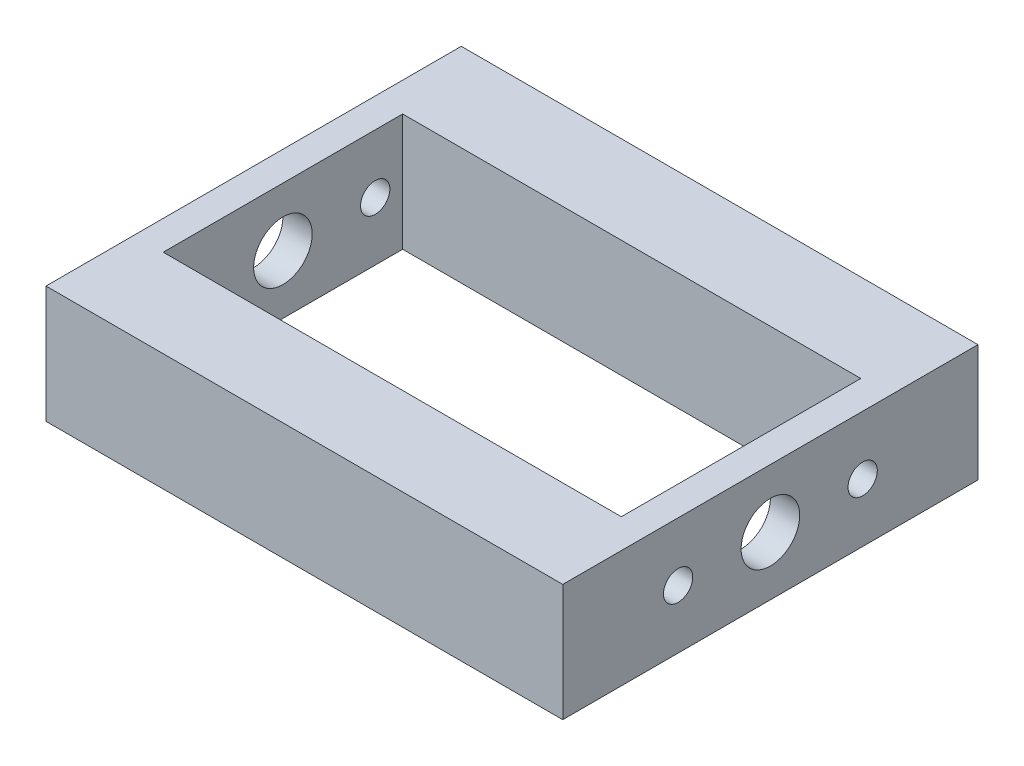
ISO-10303-21;
HEADER;
FILE_DESCRIPTION(('STEP AP214'),'2;1');
FILE_NAME('part.step','',(''),(''),'','','');
FILE_SCHEMA(('AUTOMOTIVE_DESIGN { 1 0 10303 214 1 1 1 1 }'));
ENDSEC;
DATA;
#1=APPLICATION_CONTEXT('core data for automotive mechanical design processes');
#2=APPLICATION_PROTOCOL_DEFINITION('international standard','automotive_design',2000,#1);
#3=PRODUCT_CONTEXT('',#1,'mechanical');
#4=PRODUCT('Part','Part','',(#3));
#5=PRODUCT_RELATED_PRODUCT_CATEGORY('part','',(#4));
#6=PRODUCT_DEFINITION_FORMATION('','',#4);
#7=PRODUCT_DEFINITION_CONTEXT('part definition',#1,'design');
#8=PRODUCT_DEFINITION('design','',#6,#7);
#9=PRODUCT_DEFINITION_SHAPE('','',#8);
#10=(LENGTH_UNIT() NAMED_UNIT(*) SI_UNIT(.MILLI.,.METRE.));
#11=(NAMED_UNIT(*) PLANE_ANGLE_UNIT() SI_UNIT($,.RADIAN.));
#12=(NAMED_UNIT(*) SI_UNIT($,.STERADIAN.) SOLID_ANGLE_UNIT());
#13=UNCERTAINTY_MEASURE_WITH_UNIT(LENGTH_MEASURE(1.E-05),#10,'distance_accuracy_value','');
#14=(GEOMETRIC_REPRESENTATION_CONTEXT(3) GLOBAL_UNCERTAINTY_ASSIGNED_CONTEXT((#13)) GLOBAL_UNIT_ASSIGNED_CONTEXT((#10,
#11,#12)) REPRESENTATION_CONTEXT('',''));
#15=CARTESIAN_POINT('',(0.,0.,0.));
#16=DIRECTION('',(0.,0.,1.));
#17=DIRECTION('',(1.,0.,0.));
#18=AXIS2_PLACEMENT_3D('',#15,#16,#17);
#19=CARTESIAN_POINT('',(0.,25.4,0.));
#20=DIRECTION('',(0.,1.,0.));
#21=DIRECTION('',(0.,0.,1.));
#22=AXIS2_PLACEMENT_3D('',#19,#20,#21);
#23=PLANE('',#22);
#24=DIRECTION('',(0.,0.,-1.));
#25=VECTOR('',#24,1.);
#26=CARTESIAN_POINT('',(-56.,25.4,45.));
#27=LINE('',#26,#25);
#28=CARTESIAN_POINT('',(-56.,25.4,45.));
#29=VERTEX_POINT('',#28);
#30=CARTESIAN_POINT('',(-56.,25.4,-45.));
#31=VERTEX_POINT('',#30);
#32=EDGE_CURVE('E59',#29,#31,#27,.T.);
#33=ORIENTED_EDGE('',*,*,#32,.F.);
#34=DIRECTION('',(1.,0.,0.));
#35=VECTOR('',#34,1.);
#36=CARTESIAN_POINT('',(75.05,25.4,45.));
#37=LINE('',#36,#35);
#38=CARTESIAN_POINT('',(56.,25.4,45.));
#39=VERTEX_POINT('',#38);
#40=EDGE_CURVE('E51',#29,#39,#37,.T.);
#41=ORIENTED_EDGE('',*,*,#40,.T.);
#42=DIRECTION('',(0.,0.,1.));
#43=VECTOR('',#42,1.);
#44=CARTESIAN_POINT('',(56.,25.4,45.));
#45=LINE('',#44,#43);
#46=CARTESIAN_POINT('',(56.,25.4,-45.));
#47=VERTEX_POINT('',#46);
#48=EDGE_CURVE('E170',#47,#39,#45,.T.);
#49=ORIENTED_EDGE('',*,*,#48,.F.);
#50=DIRECTION('',(-1.,0.,0.));
#51=VECTOR('',#50,1.);
#52=CARTESIAN_POINT('',(75.05,25.4,-45.));
#53=LINE('',#52,#51);
#54=EDGE_CURVE('E11',#47,#31,#53,.T.);
#55=ORIENTED_EDGE('',*,*,#54,.T.);
#56=EDGE_LOOP('',(#33,#41,#49,#55));
#57=FACE_BOUND('',#56,.T.);
#58=DIRECTION('',(0.,0.,1.));
#59=VECTOR('',#58,1.);
#60=CARTESIAN_POINT('',(-49.65,25.4,25.95));
#61=LINE('',#60,#59);
#62=CARTESIAN_POINT('',(-49.65,25.4,-25.95));
#63=VERTEX_POINT('',#62);
#64=CARTESIAN_POINT('',(-49.65,25.4,25.95));
#65=VERTEX_POINT('',#64);
#66=EDGE_CURVE('E206',#63,#65,#61,.T.);
#67=ORIENTED_EDGE('',*,*,#66,.F.);
#68=DIRECTION('',(-1.,0.,0.));
#69=VECTOR('',#68,1.);
#70=CARTESIAN_POINT('',(-49.65,25.4,-25.95));
#71=LINE('',#70,#69);
#72=CARTESIAN_POINT('',(49.65,25.4,-25.95));
#73=VERTEX_POINT('',#72);
#74=EDGE_CURVE('E203',#73,#63,#71,.T.);
#75=ORIENTED_EDGE('',*,*,#74,.F.);
#76=DIRECTION('',(0.,0.,-1.));
#77=VECTOR('',#76,1.);
#78=CARTESIAN_POINT('',(49.65,25.4,25.95));
#79=LINE('',#78,#77);
#80=CARTESIAN_POINT('',(49.65,25.4,25.95));
#81=VERTEX_POINT('',#80);
#82=EDGE_CURVE('E214',#81,#73,#79,.T.);
#83=ORIENTED_EDGE('',*,*,#82,.F.);
#84=DIRECTION('',(1.,0.,0.));
#85=VECTOR('',#84,1.);
#86=CARTESIAN_POINT('',(-49.65,25.4,25.95));
#87=LINE('',#86,#85);
#88=EDGE_CURVE('E210',#65,#81,#87,.T.);
#89=ORIENTED_EDGE('',*,*,#88,.F.);
#90=EDGE_LOOP('',(#67,#75,#83,#89));
#91=FACE_BOUND('',#90,.T.);
#92=ADVANCED_FACE('F41',(#57,#91),#23,.T.);
#93=CARTESIAN_POINT('',(0.,0.,0.));
#94=DIRECTION('',(0.,1.,0.));
#95=DIRECTION('',(0.,0.,1.));
#96=AXIS2_PLACEMENT_3D('',#93,#94,#95);
#97=PLANE('',#96);
#98=DIRECTION('',(1.,0.,0.));
#99=VECTOR('',#98,1.);
#100=CARTESIAN_POINT('',(75.05,0.,45.));
#101=LINE('',#100,#99);
#102=CARTESIAN_POINT('',(-56.,0.,45.));
#103=VERTEX_POINT('',#102);
#104=CARTESIAN_POINT('',(56.,0.,45.));
#105=VERTEX_POINT('',#104);
#106=EDGE_CURVE('E123',#103,#105,#101,.T.);
#107=ORIENTED_EDGE('',*,*,#106,.F.);
#108=DIRECTION('',(0.,0.,-1.));
#109=VECTOR('',#108,1.);
#110=CARTESIAN_POINT('',(-56.,0.,45.));
#111=LINE('',#110,#109);
#112=CARTESIAN_POINT('',(-56.,0.,-45.));
#113=VERTEX_POINT('',#112);
#114=EDGE_CURVE('E107',#103,#113,#111,.T.);
#115=ORIENTED_EDGE('',*,*,#114,.T.);
#116=DIRECTION('',(-1.,0.,0.));
#117=VECTOR('',#116,1.);
#118=CARTESIAN_POINT('',(75.05,0.,-45.));
#119=LINE('',#118,#117);
#120=CARTESIAN_POINT('',(56.,0.,-45.));
#121=VERTEX_POINT('',#120);
#122=EDGE_CURVE('E130',#121,#113,#119,.T.);
#123=ORIENTED_EDGE('',*,*,#122,.F.);
#124=DIRECTION('',(0.,0.,1.));
#125=VECTOR('',#124,1.);
#126=CARTESIAN_POINT('',(56.,0.,45.));
#127=LINE('',#126,#125);
#128=EDGE_CURVE('E67',#121,#105,#127,.T.);
#129=ORIENTED_EDGE('',*,*,#128,.T.);
#130=EDGE_LOOP('',(#107,#115,#123,#129));
#131=FACE_BOUND('',#130,.T.);
#132=DIRECTION('',(-1.,0.,0.));
#133=VECTOR('',#132,1.);
#134=CARTESIAN_POINT('',(-49.65,0.,-25.95));
#135=LINE('',#134,#133);
#136=CARTESIAN_POINT('',(49.65,0.,-25.95));
#137=VERTEX_POINT('',#136);
#138=CARTESIAN_POINT('',(-49.65,0.,-25.95));
#139=VERTEX_POINT('',#138);
#140=EDGE_CURVE('E202',#137,#139,#135,.T.);
#141=ORIENTED_EDGE('',*,*,#140,.T.);
#142=DIRECTION('',(0.,0.,1.));
#143=VECTOR('',#142,1.);
#144=CARTESIAN_POINT('',(-49.65,0.,25.95));
#145=LINE('',#144,#143);
#146=CARTESIAN_POINT('',(-49.65,0.,25.95));
#147=VERTEX_POINT('',#146);
#148=EDGE_CURVE('E221',#139,#147,#145,.T.);
#149=ORIENTED_EDGE('',*,*,#148,.T.);
#150=DIRECTION('',(1.,0.,0.));
#151=VECTOR('',#150,1.);
#152=CARTESIAN_POINT('',(-49.65,0.,25.95));
#153=LINE('',#152,#151);
#154=CARTESIAN_POINT('',(49.65,0.,25.95));
#155=VERTEX_POINT('',#154);
#156=EDGE_CURVE('E225',#147,#155,#153,.T.);
#157=ORIENTED_EDGE('',*,*,#156,.T.);
#158=DIRECTION('',(0.,0.,-1.));
#159=VECTOR('',#158,1.);
#160=CARTESIAN_POINT('',(49.65,0.,25.95));
#161=LINE('',#160,#159);
#162=EDGE_CURVE('E207',#155,#137,#161,.T.);
#163=ORIENTED_EDGE('',*,*,#162,.T.);
#164=EDGE_LOOP('',(#141,#149,#157,#163));
#165=FACE_BOUND('',#164,.T.);
#166=ADVANCED_FACE('F127',(#131,#165),#97,.F.);
#167=CARTESIAN_POINT('',(75.05,25.4,45.));
#168=DIRECTION('',(0.,0.,-1.));
#169=DIRECTION('',(-1.,0.,0.));
#170=AXIS2_PLACEMENT_3D('',#167,#168,#169);
#171=PLANE('',#170);
#172=ORIENTED_EDGE('',*,*,#40,.F.);
#173=DIRECTION('',(0.,1.,0.));
#174=VECTOR('',#173,1.);
#175=CARTESIAN_POINT('',(-56.,0.,45.));
#176=LINE('',#175,#174);
#177=EDGE_CURVE('E111',#103,#29,#176,.T.);
#178=ORIENTED_EDGE('',*,*,#177,.F.);
#179=ORIENTED_EDGE('',*,*,#106,.T.);
#180=DIRECTION('',(0.,1.,0.));
#181=VECTOR('',#180,1.);
#182=CARTESIAN_POINT('',(56.,0.,45.));
#183=LINE('',#182,#181);
#184=EDGE_CURVE('E173',#105,#39,#183,.T.);
#185=ORIENTED_EDGE('',*,*,#184,.T.);
#186=EDGE_LOOP('',(#172,#178,#179,#185));
#187=FACE_BOUND('',#186,.T.);
#188=ADVANCED_FACE('F43',(#187),#171,.F.);
#189=CARTESIAN_POINT('',(75.05,25.4,-45.));
#190=DIRECTION('',(0.,0.,1.));
#191=DIRECTION('',(1.,0.,0.));
#192=AXIS2_PLACEMENT_3D('',#189,#190,#191);
#193=PLANE('',#192);
#194=ORIENTED_EDGE('',*,*,#122,.T.);
#195=DIRECTION('',(0.,1.,0.));
#196=VECTOR('',#195,1.);
#197=CARTESIAN_POINT('',(-56.,0.,-45.));
#198=LINE('',#197,#196);
#199=EDGE_CURVE('E112',#113,#31,#198,.T.);
#200=ORIENTED_EDGE('',*,*,#199,.T.);
#201=ORIENTED_EDGE('',*,*,#54,.F.);
#202=DIRECTION('',(0.,1.,0.));
#203=VECTOR('',#202,1.);
#204=CARTESIAN_POINT('',(56.,0.,-45.));
#205=LINE('',#204,#203);
#206=EDGE_CURVE('E169',#121,#47,#205,.T.);
#207=ORIENTED_EDGE('',*,*,#206,.F.);
#208=EDGE_LOOP('',(#194,#200,#201,#207));
#209=FACE_BOUND('',#208,.T.);
#210=ADVANCED_FACE('F244',(#209),#193,.F.);
#211=CARTESIAN_POINT('',(-49.65,25.4,-25.95));
#212=DIRECTION('',(0.,0.,1.));
#213=DIRECTION('',(1.,0.,0.));
#214=AXIS2_PLACEMENT_3D('',#211,#212,#213);
#215=PLANE('',#214);
#216=ORIENTED_EDGE('',*,*,#140,.F.);
#217=DIRECTION('',(0.,-1.,0.));
#218=VECTOR('',#217,1.);
#219=CARTESIAN_POINT('',(49.65,25.4,-25.95));
#220=LINE('',#219,#218);
#221=EDGE_CURVE('E217',#73,#137,#220,.T.);
#222=ORIENTED_EDGE('',*,*,#221,.F.);
#223=ORIENTED_EDGE('',*,*,#74,.T.);
#224=DIRECTION('',(0.,-1.,0.));
#225=VECTOR('',#224,1.);
#226=CARTESIAN_POINT('',(-49.65,25.4,-25.95));
#227=LINE('',#226,#225);
#228=EDGE_CURVE('E131',#63,#139,#227,.T.);
#229=ORIENTED_EDGE('',*,*,#228,.T.);
#230=EDGE_LOOP('',(#216,#222,#223,#229));
#231=FACE_BOUND('',#230,.T.);
#232=ADVANCED_FACE('F279',(#231),#215,.T.);
#233=CARTESIAN_POINT('',(-49.65,25.4,25.95));
#234=DIRECTION('',(1.,0.,0.));
#235=DIRECTION('',(0.,0.,-1.));
#236=AXIS2_PLACEMENT_3D('',#233,#234,#235);
#237=PLANE('',#236);
#238=CARTESIAN_POINT('',(-49.65,12.7,0.));
#239=DIRECTION('',(1.,0.,0.));
#240=DIRECTION('',(0.,0.,-1.));
#241=AXIS2_PLACEMENT_3D('',#238,#239,#240);
#242=CIRCLE('',#241,6.35);
#243=CARTESIAN_POINT('',(-49.65,12.7,-6.35));
#244=VERTEX_POINT('',#243);
#245=EDGE_CURVE('E146',#244,#244,#242,.T.);
#246=ORIENTED_EDGE('',*,*,#245,.F.);
#247=EDGE_LOOP('',(#246));
#248=FACE_BOUND('',#247,.T.);
#249=CARTESIAN_POINT('',(-49.65,12.7,20.));
#250=DIRECTION('',(1.,0.,0.));
#251=DIRECTION('',(0.,0.,-1.));
#252=AXIS2_PLACEMENT_3D('',#249,#250,#251);
#253=CIRCLE('',#252,3.175);
#254=CARTESIAN_POINT('',(-49.65,12.7,16.825));
#255=VERTEX_POINT('',#254);
#256=EDGE_CURVE('E150',#255,#255,#253,.T.);
#257=ORIENTED_EDGE('',*,*,#256,.F.);
#258=EDGE_LOOP('',(#257));
#259=FACE_BOUND('',#258,.T.);
#260=CARTESIAN_POINT('',(-49.65,12.7,-20.));
#261=DIRECTION('',(1.,0.,0.));
#262=DIRECTION('',(0.,0.,-1.));
#263=AXIS2_PLACEMENT_3D('',#260,#261,#262);
#264=CIRCLE('',#263,3.175);
#265=CARTESIAN_POINT('',(-49.65,12.7,-23.175));
#266=VERTEX_POINT('',#265);
#267=EDGE_CURVE('E145',#266,#266,#264,.T.);
#268=ORIENTED_EDGE('',*,*,#267,.F.);
#269=EDGE_LOOP('',(#268));
#270=FACE_BOUND('',#269,.T.);
#271=ORIENTED_EDGE('',*,*,#148,.F.);
#272=ORIENTED_EDGE('',*,*,#228,.F.);
#273=ORIENTED_EDGE('',*,*,#66,.T.);
#274=DIRECTION('',(0.,-1.,0.));
#275=VECTOR('',#274,1.);
#276=CARTESIAN_POINT('',(-49.65,25.4,25.95));
#277=LINE('',#276,#275);
#278=EDGE_CURVE('E137',#65,#147,#277,.T.);
#279=ORIENTED_EDGE('',*,*,#278,.T.);
#280=EDGE_LOOP('',(#271,#272,#273,#279));
#281=FACE_BOUND('',#280,.T.);
#282=ADVANCED_FACE('F282',(#248,#259,#270,#281),#237,.T.);
#283=CARTESIAN_POINT('',(-49.65,25.4,25.95));
#284=DIRECTION('',(0.,0.,-1.));
#285=DIRECTION('',(-1.,0.,0.));
#286=AXIS2_PLACEMENT_3D('',#283,#284,#285);
#287=PLANE('',#286);
#288=ORIENTED_EDGE('',*,*,#156,.F.);
#289=ORIENTED_EDGE('',*,*,#278,.F.);
#290=ORIENTED_EDGE('',*,*,#88,.T.);
#291=DIRECTION('',(0.,-1.,0.));
#292=VECTOR('',#291,1.);
#293=CARTESIAN_POINT('',(49.65,25.4,25.95));
#294=LINE('',#293,#292);
#295=EDGE_CURVE('E235',#81,#155,#294,.T.);
#296=ORIENTED_EDGE('',*,*,#295,.T.);
#297=EDGE_LOOP('',(#288,#289,#290,#296));
#298=FACE_BOUND('',#297,.T.);
#299=ADVANCED_FACE('F266',(#298),#287,.T.);
#300=CARTESIAN_POINT('',(49.65,25.4,25.95));
#301=DIRECTION('',(-1.,0.,0.));
#302=DIRECTION('',(0.,0.,1.));
#303=AXIS2_PLACEMENT_3D('',#300,#301,#302);
#304=PLANE('',#303);
#305=CARTESIAN_POINT('',(49.65,12.7,0.));
#306=DIRECTION('',(-1.,0.,0.));
#307=DIRECTION('',(0.,0.,1.));
#308=AXIS2_PLACEMENT_3D('',#305,#306,#307);
#309=CIRCLE('',#308,6.35);
#310=CARTESIAN_POINT('',(49.65,12.7,6.35));
#311=VERTEX_POINT('',#310);
#312=EDGE_CURVE('E189',#311,#311,#309,.T.);
#313=ORIENTED_EDGE('',*,*,#312,.F.);
#314=EDGE_LOOP('',(#313));
#315=FACE_BOUND('',#314,.T.);
#316=CARTESIAN_POINT('',(49.65,12.7,20.));
#317=DIRECTION('',(-1.,0.,0.));
#318=DIRECTION('',(0.,0.,1.));
#319=AXIS2_PLACEMENT_3D('',#316,#317,#318);
#320=CIRCLE('',#319,3.175);
#321=CARTESIAN_POINT('',(49.65,12.7,23.175));
#322=VERTEX_POINT('',#321);
#323=EDGE_CURVE('E147',#322,#322,#320,.T.);
#324=ORIENTED_EDGE('',*,*,#323,.F.);
#325=EDGE_LOOP('',(#324));
#326=FACE_BOUND('',#325,.T.);
#327=CARTESIAN_POINT('',(49.65,12.7,-20.));
#328=DIRECTION('',(-1.,0.,0.));
#329=DIRECTION('',(0.,0.,1.));
#330=AXIS2_PLACEMENT_3D('',#327,#328,#329);
#331=CIRCLE('',#330,3.175);
#332=CARTESIAN_POINT('',(49.65,12.7,-16.825));
#333=VERTEX_POINT('',#332);
#334=EDGE_CURVE('E141',#333,#333,#331,.T.);
#335=ORIENTED_EDGE('',*,*,#334,.F.);
#336=EDGE_LOOP('',(#335));
#337=FACE_BOUND('',#336,.T.);
#338=ORIENTED_EDGE('',*,*,#162,.F.);
#339=ORIENTED_EDGE('',*,*,#295,.F.);
#340=ORIENTED_EDGE('',*,*,#82,.T.);
#341=ORIENTED_EDGE('',*,*,#221,.T.);
#342=EDGE_LOOP('',(#338,#339,#340,#341));
#343=FACE_BOUND('',#342,.T.);
#344=ADVANCED_FACE('F259',(#315,#326,#337,#343),#304,.T.);
#345=CARTESIAN_POINT('',(-99.1,12.7,-20.));
#346=DIRECTION('',(1.,0.,0.));
#347=DIRECTION('',(0.,0.,-1.));
#348=AXIS2_PLACEMENT_3D('',#345,#346,#347);
#349=CYLINDRICAL_SURFACE('',#348,3.175);
#350=CARTESIAN_POINT('',(56.,12.7,-20.));
#351=DIRECTION('',(-1.,0.,0.));
#352=DIRECTION('',(0.,0.,1.));
#353=AXIS2_PLACEMENT_3D('',#350,#351,#352);
#354=CIRCLE('',#353,3.175);
#355=CARTESIAN_POINT('',(56.,12.7,-16.825));
#356=VERTEX_POINT('',#355);
#357=EDGE_CURVE('E185',#356,#356,#354,.F.);
#358=ORIENTED_EDGE('',*,*,#357,.T.);
#359=EDGE_LOOP('',(#358));
#360=FACE_BOUND('',#359,.T.);
#361=ORIENTED_EDGE('',*,*,#334,.T.);
#362=EDGE_LOOP('',(#361));
#363=FACE_BOUND('',#362,.T.);
#364=ADVANCED_FACE('F255',(#360,#363),#349,.F.);
#365=CARTESIAN_POINT('',(-99.1,12.7,20.));
#366=DIRECTION('',(1.,0.,0.));
#367=DIRECTION('',(0.,0.,-1.));
#368=AXIS2_PLACEMENT_3D('',#365,#366,#367);
#369=CYLINDRICAL_SURFACE('',#368,3.175);
#370=CARTESIAN_POINT('',(56.,12.7,20.));
#371=DIRECTION('',(-1.,0.,0.));
#372=DIRECTION('',(0.,0.,1.));
#373=AXIS2_PLACEMENT_3D('',#370,#371,#372);
#374=CIRCLE('',#373,3.175);
#375=CARTESIAN_POINT('',(56.,12.7,23.175));
#376=VERTEX_POINT('',#375);
#377=EDGE_CURVE('E181',#376,#376,#374,.F.);
#378=ORIENTED_EDGE('',*,*,#377,.T.);
#379=EDGE_LOOP('',(#378));
#380=FACE_BOUND('',#379,.T.);
#381=ORIENTED_EDGE('',*,*,#323,.T.);
#382=EDGE_LOOP('',(#381));
#383=FACE_BOUND('',#382,.T.);
#384=ADVANCED_FACE('F258',(#380,#383),#369,.F.);
#385=CARTESIAN_POINT('',(-56.,12.7,-20.));
#386=DIRECTION('',(1.,0.,0.));
#387=DIRECTION('',(0.,0.,-1.));
#388=AXIS2_PLACEMENT_3D('',#385,#386,#387);
#389=CIRCLE('',#388,3.175);
#390=CARTESIAN_POINT('',(-56.,12.7,-23.175));
#391=VERTEX_POINT('',#390);
#392=EDGE_CURVE('E160',#391,#391,#389,.F.);
#393=ORIENTED_EDGE('',*,*,#392,.T.);
#394=EDGE_LOOP('',(#393));
#395=FACE_BOUND('',#394,.T.);
#396=ORIENTED_EDGE('',*,*,#267,.T.);
#397=EDGE_LOOP('',(#396));
#398=FACE_BOUND('',#397,.T.);
#399=ADVANCED_FACE('F261',(#395,#398),#349,.F.);
#400=CARTESIAN_POINT('',(-56.,12.7,20.));
#401=DIRECTION('',(1.,0.,0.));
#402=DIRECTION('',(0.,0.,-1.));
#403=AXIS2_PLACEMENT_3D('',#400,#401,#402);
#404=CIRCLE('',#403,3.175);
#405=CARTESIAN_POINT('',(-56.,12.7,16.825));
#406=VERTEX_POINT('',#405);
#407=EDGE_CURVE('E154',#406,#406,#404,.F.);
#408=ORIENTED_EDGE('',*,*,#407,.T.);
#409=EDGE_LOOP('',(#408));
#410=FACE_BOUND('',#409,.T.);
#411=ORIENTED_EDGE('',*,*,#256,.T.);
#412=EDGE_LOOP('',(#411));
#413=FACE_BOUND('',#412,.T.);
#414=ADVANCED_FACE('F359',(#410,#413),#369,.F.);
#415=CARTESIAN_POINT('',(-99.1,12.7,0.));
#416=DIRECTION('',(1.,0.,0.));
#417=DIRECTION('',(0.,0.,-1.));
#418=AXIS2_PLACEMENT_3D('',#415,#416,#417);
#419=CYLINDRICAL_SURFACE('',#418,6.35);
#420=CARTESIAN_POINT('',(56.,12.7,0.));
#421=DIRECTION('',(-1.,0.,0.));
#422=DIRECTION('',(0.,0.,1.));
#423=AXIS2_PLACEMENT_3D('',#420,#421,#422);
#424=CIRCLE('',#423,6.35);
#425=CARTESIAN_POINT('',(56.,12.7,6.35));
#426=VERTEX_POINT('',#425);
#427=EDGE_CURVE('E45',#426,#426,#424,.F.);
#428=ORIENTED_EDGE('',*,*,#427,.T.);
#429=EDGE_LOOP('',(#428));
#430=FACE_BOUND('',#429,.T.);
#431=ORIENTED_EDGE('',*,*,#312,.T.);
#432=EDGE_LOOP('',(#431));
#433=FACE_BOUND('',#432,.T.);
#434=ADVANCED_FACE('F375',(#430,#433),#419,.F.);
#435=CARTESIAN_POINT('',(-56.,12.7,0.));
#436=DIRECTION('',(1.,0.,0.));
#437=DIRECTION('',(0.,0.,-1.));
#438=AXIS2_PLACEMENT_3D('',#435,#436,#437);
#439=CIRCLE('',#438,6.35);
#440=CARTESIAN_POINT('',(-56.,12.7,-6.35));
#441=VERTEX_POINT('',#440);
#442=EDGE_CURVE('E151',#441,#441,#439,.F.);
#443=ORIENTED_EDGE('',*,*,#442,.T.);
#444=EDGE_LOOP('',(#443));
#445=FACE_BOUND('',#444,.T.);
#446=ORIENTED_EDGE('',*,*,#245,.T.);
#447=EDGE_LOOP('',(#446));
#448=FACE_BOUND('',#447,.T.);
#449=ADVANCED_FACE('F384',(#445,#448),#419,.F.);
#450=CARTESIAN_POINT('',(-56.,0.,45.));
#451=DIRECTION('',(1.,0.,0.));
#452=DIRECTION('',(0.,0.,-1.));
#453=AXIS2_PLACEMENT_3D('',#450,#451,#452);
#454=PLANE('',#453);
#455=ORIENTED_EDGE('',*,*,#407,.F.);
#456=EDGE_LOOP('',(#455));
#457=FACE_BOUND('',#456,.T.);
#458=ORIENTED_EDGE('',*,*,#32,.T.);
#459=ORIENTED_EDGE('',*,*,#199,.F.);
#460=ORIENTED_EDGE('',*,*,#114,.F.);
#461=ORIENTED_EDGE('',*,*,#177,.T.);
#462=EDGE_LOOP('',(#458,#459,#460,#461));
#463=FACE_BOUND('',#462,.T.);
#464=ORIENTED_EDGE('',*,*,#442,.F.);
#465=EDGE_LOOP('',(#464));
#466=FACE_BOUND('',#465,.T.);
#467=ORIENTED_EDGE('',*,*,#392,.F.);
#468=EDGE_LOOP('',(#467));
#469=FACE_BOUND('',#468,.T.);
#470=ADVANCED_FACE('F109',(#457,#463,#466,#469),#454,.F.);
#471=CARTESIAN_POINT('',(56.,0.,45.));
#472=DIRECTION('',(-1.,0.,0.));
#473=DIRECTION('',(0.,0.,1.));
#474=AXIS2_PLACEMENT_3D('',#471,#472,#473);
#475=PLANE('',#474);
#476=ORIENTED_EDGE('',*,*,#377,.F.);
#477=EDGE_LOOP('',(#476));
#478=FACE_BOUND('',#477,.T.);
#479=ORIENTED_EDGE('',*,*,#48,.T.);
#480=ORIENTED_EDGE('',*,*,#184,.F.);
#481=ORIENTED_EDGE('',*,*,#128,.F.);
#482=ORIENTED_EDGE('',*,*,#206,.T.);
#483=EDGE_LOOP('',(#479,#480,#481,#482));
#484=FACE_BOUND('',#483,.T.);
#485=ORIENTED_EDGE('',*,*,#427,.F.);
#486=EDGE_LOOP('',(#485));
#487=FACE_BOUND('',#486,.T.);
#488=ORIENTED_EDGE('',*,*,#357,.F.);
#489=EDGE_LOOP('',(#488));
#490=FACE_BOUND('',#489,.T.);
#491=ADVANCED_FACE('F245',(#478,#484,#487,#490),#475,.F.);
#492=CLOSED_SHELL('',(#92,#166,#188,#210,#232,#282,#299,#344,#364,#384,#399,#414,#434,#449,#470,#491));
#493=MANIFOLD_SOLID_BREP('B2',#492);
#494=ADVANCED_BREP_SHAPE_REPRESENTATION('',(#18,#493),#14);
#495=SHAPE_DEFINITION_REPRESENTATION(#9,#494);
ENDSEC;
END-ISO-10303-21;
